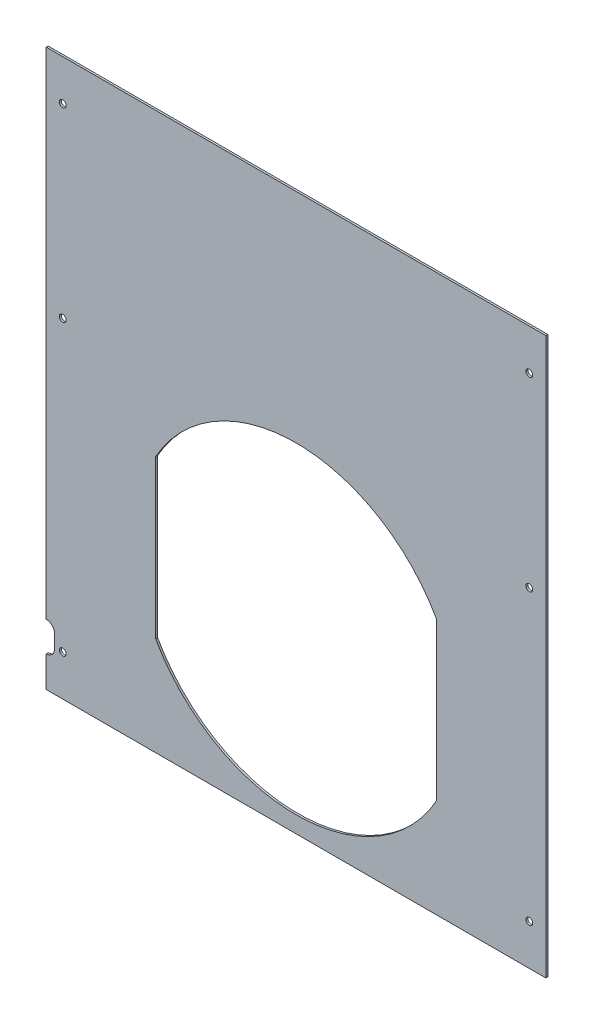
ISO-10303-21;
HEADER;
FILE_DESCRIPTION(('STEP AP214'),'2;1');
FILE_NAME('part.step','',(''),(''),'','','');
FILE_SCHEMA(('AUTOMOTIVE_DESIGN { 1 0 10303 214 1 1 1 1 }'));
ENDSEC;
DATA;
#1=APPLICATION_CONTEXT('core data for automotive mechanical design processes');
#2=APPLICATION_PROTOCOL_DEFINITION('international standard','automotive_design',2000,#1);
#3=PRODUCT_CONTEXT('',#1,'mechanical');
#4=PRODUCT('Part','Part','',(#3));
#5=PRODUCT_RELATED_PRODUCT_CATEGORY('part','',(#4));
#6=PRODUCT_DEFINITION_FORMATION('','',#4);
#7=PRODUCT_DEFINITION_CONTEXT('part definition',#1,'design');
#8=PRODUCT_DEFINITION('design','',#6,#7);
#9=PRODUCT_DEFINITION_SHAPE('','',#8);
#10=(LENGTH_UNIT() NAMED_UNIT(*) SI_UNIT(.MILLI.,.METRE.));
#11=(NAMED_UNIT(*) PLANE_ANGLE_UNIT() SI_UNIT($,.RADIAN.));
#12=(NAMED_UNIT(*) SI_UNIT($,.STERADIAN.) SOLID_ANGLE_UNIT());
#13=UNCERTAINTY_MEASURE_WITH_UNIT(LENGTH_MEASURE(1.E-05),#10,'distance_accuracy_value','');
#14=(GEOMETRIC_REPRESENTATION_CONTEXT(3) GLOBAL_UNCERTAINTY_ASSIGNED_CONTEXT((#13)) GLOBAL_UNIT_ASSIGNED_CONTEXT((#10,
#11,#12)) REPRESENTATION_CONTEXT('',''));
#15=CARTESIAN_POINT('',(0.,0.,0.));
#16=DIRECTION('',(0.,0.,1.));
#17=DIRECTION('',(1.,0.,0.));
#18=AXIS2_PLACEMENT_3D('',#15,#16,#17);
#19=CARTESIAN_POINT('',(-242.,269.5,-1.89738));
#20=DIRECTION('',(-1.,0.,0.));
#21=DIRECTION('',(0.,-1.,0.));
#22=AXIS2_PLACEMENT_3D('',#19,#20,#21);
#23=PLANE('',#22);
#24=DIRECTION('',(0.,0.,1.));
#25=VECTOR('',#24,1.);
#26=CARTESIAN_POINT('',(-242.,-239.5,-1.89738));
#27=LINE('',#26,#25);
#28=CARTESIAN_POINT('',(-242.,-239.5,-1.89738));
#29=VERTEX_POINT('',#28);
#30=CARTESIAN_POINT('',(-242.,-239.5,0.));
#31=VERTEX_POINT('',#30);
#32=EDGE_CURVE('E81',#29,#31,#27,.T.);
#33=ORIENTED_EDGE('',*,*,#32,.F.);
#34=DIRECTION('',(0.,-1.,0.));
#35=VECTOR('',#34,1.);
#36=CARTESIAN_POINT('',(-242.,269.5,-1.89738));
#37=LINE('',#36,#35);
#38=CARTESIAN_POINT('',(-242.,-269.5,-1.89738));
#39=VERTEX_POINT('',#38);
#40=EDGE_CURVE('E151',#29,#39,#37,.T.);
#41=ORIENTED_EDGE('',*,*,#40,.T.);
#42=DIRECTION('',(0.,0.,1.));
#43=VECTOR('',#42,1.);
#44=CARTESIAN_POINT('',(-242.,-269.5,-1.89738));
#45=LINE('',#44,#43);
#46=CARTESIAN_POINT('',(-242.,-269.5,0.));
#47=VERTEX_POINT('',#46);
#48=EDGE_CURVE('E161',#39,#47,#45,.T.);
#49=ORIENTED_EDGE('',*,*,#48,.T.);
#50=DIRECTION('',(0.,-1.,0.));
#51=VECTOR('',#50,1.);
#52=CARTESIAN_POINT('',(-242.,269.5,0.));
#53=LINE('',#52,#51);
#54=EDGE_CURVE('E143',#31,#47,#53,.T.);
#55=ORIENTED_EDGE('',*,*,#54,.F.);
#56=EDGE_LOOP('',(#33,#41,#49,#55));
#57=FACE_BOUND('',#56,.T.);
#58=ADVANCED_FACE('F40',(#57),#23,.T.);
#59=DIRECTION('',(0.,0.,1.));
#60=VECTOR('',#59,1.);
#61=CARTESIAN_POINT('',(-242.,-210.5,-1.89738));
#62=LINE('',#61,#60);
#63=CARTESIAN_POINT('',(-242.,-210.5,-1.89738));
#64=VERTEX_POINT('',#63);
#65=CARTESIAN_POINT('',(-242.,-210.5,0.));
#66=VERTEX_POINT('',#65);
#67=EDGE_CURVE('E139',#64,#66,#62,.T.);
#68=ORIENTED_EDGE('',*,*,#67,.T.);
#69=CARTESIAN_POINT('',(-242.,269.5,0.));
#70=VERTEX_POINT('',#69);
#71=EDGE_CURVE('E137',#70,#66,#53,.T.);
#72=ORIENTED_EDGE('',*,*,#71,.F.);
#73=DIRECTION('',(0.,0.,1.));
#74=VECTOR('',#73,1.);
#75=CARTESIAN_POINT('',(-242.,269.5,-1.89738));
#76=LINE('',#75,#74);
#77=CARTESIAN_POINT('',(-242.,269.5,-1.89738));
#78=VERTEX_POINT('',#77);
#79=EDGE_CURVE('E122',#78,#70,#76,.T.);
#80=ORIENTED_EDGE('',*,*,#79,.F.);
#81=EDGE_CURVE('E153',#78,#64,#37,.T.);
#82=ORIENTED_EDGE('',*,*,#81,.T.);
#83=EDGE_LOOP('',(#68,#72,#80,#82));
#84=FACE_BOUND('',#83,.T.);
#85=ADVANCED_FACE('F42',(#84),#23,.T.);
#86=CARTESIAN_POINT('',(-242.,269.5,-1.89738));
#87=DIRECTION('',(0.,1.,0.));
#88=DIRECTION('',(0.,0.,1.));
#89=AXIS2_PLACEMENT_3D('',#86,#87,#88);
#90=PLANE('',#89);
#91=DIRECTION('',(-1.,0.,0.));
#92=VECTOR('',#91,1.);
#93=CARTESIAN_POINT('',(-242.,269.5,0.));
#94=LINE('',#93,#92);
#95=CARTESIAN_POINT('',(242.,269.5,0.));
#96=VERTEX_POINT('',#95);
#97=EDGE_CURVE('E126',#96,#70,#94,.T.);
#98=ORIENTED_EDGE('',*,*,#97,.F.);
#99=DIRECTION('',(0.,0.,1.));
#100=VECTOR('',#99,1.);
#101=CARTESIAN_POINT('',(242.,269.5,-1.89738));
#102=LINE('',#101,#100);
#103=CARTESIAN_POINT('',(242.,269.5,-1.89738));
#104=VERTEX_POINT('',#103);
#105=EDGE_CURVE('E133',#104,#96,#102,.T.);
#106=ORIENTED_EDGE('',*,*,#105,.F.);
#107=DIRECTION('',(-1.,0.,0.));
#108=VECTOR('',#107,1.);
#109=CARTESIAN_POINT('',(-242.,269.5,-1.89738));
#110=LINE('',#109,#108);
#111=EDGE_CURVE('E128',#104,#78,#110,.T.);
#112=ORIENTED_EDGE('',*,*,#111,.T.);
#113=ORIENTED_EDGE('',*,*,#79,.T.);
#114=EDGE_LOOP('',(#98,#106,#112,#113));
#115=FACE_BOUND('',#114,.T.);
#116=ADVANCED_FACE('F124',(#115),#90,.T.);
#117=CARTESIAN_POINT('',(242.,269.5,-1.89738));
#118=DIRECTION('',(1.,0.,0.));
#119=DIRECTION('',(0.,1.,0.));
#120=AXIS2_PLACEMENT_3D('',#117,#118,#119);
#121=PLANE('',#120);
#122=DIRECTION('',(0.,1.,0.));
#123=VECTOR('',#122,1.);
#124=CARTESIAN_POINT('',(242.,269.5,0.));
#125=LINE('',#124,#123);
#126=CARTESIAN_POINT('',(242.,-269.5,0.));
#127=VERTEX_POINT('',#126);
#128=EDGE_CURVE('E150',#127,#96,#125,.T.);
#129=ORIENTED_EDGE('',*,*,#128,.F.);
#130=DIRECTION('',(0.,0.,1.));
#131=VECTOR('',#130,1.);
#132=CARTESIAN_POINT('',(242.,-269.5,-1.89738));
#133=LINE('',#132,#131);
#134=CARTESIAN_POINT('',(242.,-269.5,-1.89738));
#135=VERTEX_POINT('',#134);
#136=EDGE_CURVE('E159',#135,#127,#133,.T.);
#137=ORIENTED_EDGE('',*,*,#136,.F.);
#138=DIRECTION('',(0.,1.,0.));
#139=VECTOR('',#138,1.);
#140=CARTESIAN_POINT('',(242.,269.5,-1.89738));
#141=LINE('',#140,#139);
#142=EDGE_CURVE('E261',#135,#104,#141,.T.);
#143=ORIENTED_EDGE('',*,*,#142,.T.);
#144=ORIENTED_EDGE('',*,*,#105,.T.);
#145=EDGE_LOOP('',(#129,#137,#143,#144));
#146=FACE_BOUND('',#145,.T.);
#147=ADVANCED_FACE('F271',(#146),#121,.T.);
#148=CARTESIAN_POINT('',(-242.,-269.5,-1.89738));
#149=DIRECTION('',(0.,-1.,0.));
#150=DIRECTION('',(0.,0.,-1.));
#151=AXIS2_PLACEMENT_3D('',#148,#149,#150);
#152=PLANE('',#151);
#153=DIRECTION('',(1.,0.,0.));
#154=VECTOR('',#153,1.);
#155=CARTESIAN_POINT('',(-242.,-269.5,0.));
#156=LINE('',#155,#154);
#157=EDGE_CURVE('E142',#47,#127,#156,.T.);
#158=ORIENTED_EDGE('',*,*,#157,.F.);
#159=ORIENTED_EDGE('',*,*,#48,.F.);
#160=DIRECTION('',(1.,0.,0.));
#161=VECTOR('',#160,1.);
#162=CARTESIAN_POINT('',(-242.,-269.5,-1.89738));
#163=LINE('',#162,#161);
#164=EDGE_CURVE('E258',#39,#135,#163,.T.);
#165=ORIENTED_EDGE('',*,*,#164,.T.);
#166=ORIENTED_EDGE('',*,*,#136,.T.);
#167=EDGE_LOOP('',(#158,#159,#165,#166));
#168=FACE_BOUND('',#167,.T.);
#169=ADVANCED_FACE('F267',(#168),#152,.T.);
#170=CARTESIAN_POINT('',(0.,0.,-1.89738));
#171=DIRECTION('',(0.,0.,1.));
#172=DIRECTION('',(1.,0.,0.));
#173=AXIS2_PLACEMENT_3D('',#170,#171,#172);
#174=PLANE('',#173);
#175=ORIENTED_EDGE('',*,*,#40,.F.);
#176=CARTESIAN_POINT('',(-242.,-231.5,-1.89738));
#177=DIRECTION('',(0.,0.,1.));
#178=DIRECTION('',(-1.,0.,0.));
#179=AXIS2_PLACEMENT_3D('',#176,#177,#178);
#180=CIRCLE('',#179,8.00000000000001);
#181=CARTESIAN_POINT('',(-234.,-231.5,-1.89738));
#182=VERTEX_POINT('',#181);
#183=EDGE_CURVE('E188',#29,#182,#180,.T.);
#184=ORIENTED_EDGE('',*,*,#183,.T.);
#185=DIRECTION('',(0.,1.,0.));
#186=VECTOR('',#185,1.);
#187=CARTESIAN_POINT('',(-234.,-218.5,-1.89738));
#188=LINE('',#187,#186);
#189=CARTESIAN_POINT('',(-234.,-218.5,-1.89738));
#190=VERTEX_POINT('',#189);
#191=EDGE_CURVE('E178',#182,#190,#188,.T.);
#192=ORIENTED_EDGE('',*,*,#191,.T.);
#193=CARTESIAN_POINT('',(-242.,-218.5,-1.89738));
#194=DIRECTION('',(0.,0.,1.));
#195=DIRECTION('',(-1.,0.,0.));
#196=AXIS2_PLACEMENT_3D('',#193,#194,#195);
#197=CIRCLE('',#196,8.00000000000001);
#198=EDGE_CURVE('E182',#190,#64,#197,.T.);
#199=ORIENTED_EDGE('',*,*,#198,.T.);
#200=ORIENTED_EDGE('',*,*,#81,.F.);
#201=ORIENTED_EDGE('',*,*,#111,.F.);
#202=ORIENTED_EDGE('',*,*,#142,.F.);
#203=ORIENTED_EDGE('',*,*,#164,.F.);
#204=EDGE_LOOP('',(#175,#184,#192,#199,#200,#201,#202,#203));
#205=FACE_BOUND('',#204,.T.);
#206=CARTESIAN_POINT('',(226.,230.,-1.89738));
#207=DIRECTION('',(0.,0.,-1.));
#208=DIRECTION('',(0.,1.,0.));
#209=AXIS2_PLACEMENT_3D('',#206,#207,#208);
#210=CIRCLE('',#209,3.29999999999983);
#211=CARTESIAN_POINT('',(226.,233.3,-1.89738));
#212=VERTEX_POINT('',#211);
#213=EDGE_CURVE('E194',#212,#212,#210,.T.);
#214=ORIENTED_EDGE('',*,*,#213,.F.);
#215=EDGE_LOOP('',(#214));
#216=FACE_BOUND('',#215,.T.);
#217=CARTESIAN_POINT('',(-226.,230.,-1.89738));
#218=DIRECTION('',(0.,0.,-1.));
#219=DIRECTION('',(0.,1.,0.));
#220=AXIS2_PLACEMENT_3D('',#217,#218,#219);
#221=CIRCLE('',#220,3.29999999999983);
#222=CARTESIAN_POINT('',(-226.,233.3,-1.89738));
#223=VERTEX_POINT('',#222);
#224=EDGE_CURVE('E201',#223,#223,#221,.T.);
#225=ORIENTED_EDGE('',*,*,#224,.F.);
#226=EDGE_LOOP('',(#225));
#227=FACE_BOUND('',#226,.T.);
#228=CARTESIAN_POINT('',(-226.,-230.,-1.89738));
#229=DIRECTION('',(0.,0.,-1.));
#230=DIRECTION('',(0.,1.,0.));
#231=AXIS2_PLACEMENT_3D('',#228,#229,#230);
#232=CIRCLE('',#231,3.29999999999983);
#233=CARTESIAN_POINT('',(-226.,-226.7,-1.89738));
#234=VERTEX_POINT('',#233);
#235=EDGE_CURVE('E207',#234,#234,#232,.T.);
#236=ORIENTED_EDGE('',*,*,#235,.F.);
#237=EDGE_LOOP('',(#236));
#238=FACE_BOUND('',#237,.T.);
#239=CARTESIAN_POINT('',(226.,-230.,-1.89738));
#240=DIRECTION('',(0.,0.,-1.));
#241=DIRECTION('',(0.,1.,0.));
#242=AXIS2_PLACEMENT_3D('',#239,#240,#241);
#243=CIRCLE('',#242,3.29999999999983);
#244=CARTESIAN_POINT('',(226.,-226.7,-1.89738));
#245=VERTEX_POINT('',#244);
#246=EDGE_CURVE('E213',#245,#245,#243,.T.);
#247=ORIENTED_EDGE('',*,*,#246,.F.);
#248=EDGE_LOOP('',(#247));
#249=FACE_BOUND('',#248,.T.);
#250=CARTESIAN_POINT('',(226.,50.0000000000001,-1.89738));
#251=DIRECTION('',(0.,0.,-1.));
#252=DIRECTION('',(0.,1.,0.));
#253=AXIS2_PLACEMENT_3D('',#250,#251,#252);
#254=CIRCLE('',#253,3.29999999999983);
#255=CARTESIAN_POINT('',(226.,53.3,-1.89738));
#256=VERTEX_POINT('',#255);
#257=EDGE_CURVE('E219',#256,#256,#254,.T.);
#258=ORIENTED_EDGE('',*,*,#257,.F.);
#259=EDGE_LOOP('',(#258));
#260=FACE_BOUND('',#259,.T.);
#261=CARTESIAN_POINT('',(-226.,50.0000000000001,-1.89738));
#262=DIRECTION('',(0.,0.,-1.));
#263=DIRECTION('',(0.,1.,0.));
#264=AXIS2_PLACEMENT_3D('',#261,#262,#263);
#265=CIRCLE('',#264,3.29999999999983);
#266=CARTESIAN_POINT('',(-226.,53.3,-1.89738));
#267=VERTEX_POINT('',#266);
#268=EDGE_CURVE('E225',#267,#267,#265,.T.);
#269=ORIENTED_EDGE('',*,*,#268,.F.);
#270=EDGE_LOOP('',(#269));
#271=FACE_BOUND('',#270,.T.);
#272=DIRECTION('',(0.,1.,0.));
#273=VECTOR('',#272,1.);
#274=CARTESIAN_POINT('',(136.,-21.0801073018289,-1.89738));
#275=LINE('',#274,#273);
#276=CARTESIAN_POINT('',(136.,-173.919892698171,-1.89738));
#277=VERTEX_POINT('',#276);
#278=CARTESIAN_POINT('',(136.,-21.0801073018289,-1.89738));
#279=VERTEX_POINT('',#278);
#280=EDGE_CURVE('E240',#277,#279,#275,.T.);
#281=ORIENTED_EDGE('',*,*,#280,.T.);
#282=CARTESIAN_POINT('',(0.,-97.5,-1.89738));
#283=DIRECTION('',(0.,0.,1.));
#284=DIRECTION('',(1.,0.,0.));
#285=AXIS2_PLACEMENT_3D('',#282,#283,#284);
#286=CIRCLE('',#285,156.);
#287=CARTESIAN_POINT('',(-136.,-21.0801073018289,-1.89738));
#288=VERTEX_POINT('',#287);
#289=EDGE_CURVE('E232',#279,#288,#286,.T.);
#290=ORIENTED_EDGE('',*,*,#289,.T.);
#291=DIRECTION('',(0.,-1.,0.));
#292=VECTOR('',#291,1.);
#293=CARTESIAN_POINT('',(-136.,-21.0801073018289,-1.89738));
#294=LINE('',#293,#292);
#295=CARTESIAN_POINT('',(-136.,-173.919892698171,-1.89738));
#296=VERTEX_POINT('',#295);
#297=EDGE_CURVE('E235',#288,#296,#294,.T.);
#298=ORIENTED_EDGE('',*,*,#297,.T.);
#299=CARTESIAN_POINT('',(0.,-97.5,-1.89738));
#300=DIRECTION('',(0.,0.,1.));
#301=DIRECTION('',(1.,0.,0.));
#302=AXIS2_PLACEMENT_3D('',#299,#300,#301);
#303=CIRCLE('',#302,156.);
#304=EDGE_CURVE('E63',#296,#277,#303,.T.);
#305=ORIENTED_EDGE('',*,*,#304,.T.);
#306=EDGE_LOOP('',(#281,#290,#298,#305));
#307=FACE_BOUND('',#306,.T.);
#308=ADVANCED_FACE('F186',(#205,#216,#227,#238,#249,#260,#271,#307),#174,.F.);
#309=CARTESIAN_POINT('',(0.,0.,0.));
#310=DIRECTION('',(0.,0.,1.));
#311=DIRECTION('',(1.,0.,0.));
#312=AXIS2_PLACEMENT_3D('',#309,#310,#311);
#313=PLANE('',#312);
#314=CARTESIAN_POINT('',(-242.,-231.5,0.));
#315=DIRECTION('',(0.,0.,1.));
#316=DIRECTION('',(1.,0.,0.));
#317=AXIS2_PLACEMENT_3D('',#314,#315,#316);
#318=CIRCLE('',#317,8.00000000000001);
#319=CARTESIAN_POINT('',(-234.,-231.5,0.));
#320=VERTEX_POINT('',#319);
#321=EDGE_CURVE('E11',#31,#320,#318,.T.);
#322=ORIENTED_EDGE('',*,*,#321,.F.);
#323=ORIENTED_EDGE('',*,*,#54,.T.);
#324=ORIENTED_EDGE('',*,*,#157,.T.);
#325=ORIENTED_EDGE('',*,*,#128,.T.);
#326=ORIENTED_EDGE('',*,*,#97,.T.);
#327=ORIENTED_EDGE('',*,*,#71,.T.);
#328=CARTESIAN_POINT('',(-242.,-218.5,0.));
#329=DIRECTION('',(0.,0.,1.));
#330=DIRECTION('',(1.,0.,0.));
#331=AXIS2_PLACEMENT_3D('',#328,#329,#330);
#332=CIRCLE('',#331,8.00000000000001);
#333=CARTESIAN_POINT('',(-234.,-218.5,0.));
#334=VERTEX_POINT('',#333);
#335=EDGE_CURVE('E48',#334,#66,#332,.T.);
#336=ORIENTED_EDGE('',*,*,#335,.F.);
#337=DIRECTION('',(0.,1.,0.));
#338=VECTOR('',#337,1.);
#339=CARTESIAN_POINT('',(-234.,-218.5,0.));
#340=LINE('',#339,#338);
#341=EDGE_CURVE('E132',#320,#334,#340,.T.);
#342=ORIENTED_EDGE('',*,*,#341,.F.);
#343=EDGE_LOOP('',(#322,#323,#324,#325,#326,#327,#336,#342));
#344=FACE_BOUND('',#343,.T.);
#345=CARTESIAN_POINT('',(226.,230.,0.));
#346=DIRECTION('',(0.,0.,-1.));
#347=DIRECTION('',(0.,1.,0.));
#348=AXIS2_PLACEMENT_3D('',#345,#346,#347);
#349=CIRCLE('',#348,3.3);
#350=CARTESIAN_POINT('',(226.,233.3,0.));
#351=VERTEX_POINT('',#350);
#352=EDGE_CURVE('E198',#351,#351,#349,.T.);
#353=ORIENTED_EDGE('',*,*,#352,.T.);
#354=EDGE_LOOP('',(#353));
#355=FACE_BOUND('',#354,.T.);
#356=CARTESIAN_POINT('',(-226.,230.,0.));
#357=DIRECTION('',(0.,0.,-1.));
#358=DIRECTION('',(0.,1.,0.));
#359=AXIS2_PLACEMENT_3D('',#356,#357,#358);
#360=CIRCLE('',#359,3.3);
#361=CARTESIAN_POINT('',(-226.,233.3,0.));
#362=VERTEX_POINT('',#361);
#363=EDGE_CURVE('E204',#362,#362,#360,.T.);
#364=ORIENTED_EDGE('',*,*,#363,.T.);
#365=EDGE_LOOP('',(#364));
#366=FACE_BOUND('',#365,.T.);
#367=CARTESIAN_POINT('',(-226.,-230.,0.));
#368=DIRECTION('',(0.,0.,-1.));
#369=DIRECTION('',(0.,1.,0.));
#370=AXIS2_PLACEMENT_3D('',#367,#368,#369);
#371=CIRCLE('',#370,3.3);
#372=CARTESIAN_POINT('',(-226.,-226.7,0.));
#373=VERTEX_POINT('',#372);
#374=EDGE_CURVE('E210',#373,#373,#371,.T.);
#375=ORIENTED_EDGE('',*,*,#374,.T.);
#376=EDGE_LOOP('',(#375));
#377=FACE_BOUND('',#376,.T.);
#378=CARTESIAN_POINT('',(226.,-230.,0.));
#379=DIRECTION('',(0.,0.,-1.));
#380=DIRECTION('',(0.,1.,0.));
#381=AXIS2_PLACEMENT_3D('',#378,#379,#380);
#382=CIRCLE('',#381,3.3);
#383=CARTESIAN_POINT('',(226.,-226.7,0.));
#384=VERTEX_POINT('',#383);
#385=EDGE_CURVE('E216',#384,#384,#382,.T.);
#386=ORIENTED_EDGE('',*,*,#385,.T.);
#387=EDGE_LOOP('',(#386));
#388=FACE_BOUND('',#387,.T.);
#389=CARTESIAN_POINT('',(226.,50.0000000000001,0.));
#390=DIRECTION('',(0.,0.,-1.));
#391=DIRECTION('',(0.,1.,0.));
#392=AXIS2_PLACEMENT_3D('',#389,#390,#391);
#393=CIRCLE('',#392,3.3);
#394=CARTESIAN_POINT('',(226.,53.3000000000001,0.));
#395=VERTEX_POINT('',#394);
#396=EDGE_CURVE('E222',#395,#395,#393,.T.);
#397=ORIENTED_EDGE('',*,*,#396,.T.);
#398=EDGE_LOOP('',(#397));
#399=FACE_BOUND('',#398,.T.);
#400=CARTESIAN_POINT('',(-226.,50.0000000000001,0.));
#401=DIRECTION('',(0.,0.,-1.));
#402=DIRECTION('',(0.,1.,0.));
#403=AXIS2_PLACEMENT_3D('',#400,#401,#402);
#404=CIRCLE('',#403,3.3);
#405=CARTESIAN_POINT('',(-226.,53.3000000000001,0.));
#406=VERTEX_POINT('',#405);
#407=EDGE_CURVE('E228',#406,#406,#404,.T.);
#408=ORIENTED_EDGE('',*,*,#407,.T.);
#409=EDGE_LOOP('',(#408));
#410=FACE_BOUND('',#409,.T.);
#411=CARTESIAN_POINT('',(0.,-97.5,0.));
#412=DIRECTION('',(0.,0.,1.));
#413=DIRECTION('',(1.,0.,0.));
#414=AXIS2_PLACEMENT_3D('',#411,#412,#413);
#415=CIRCLE('',#414,156.);
#416=CARTESIAN_POINT('',(136.,-21.0801073018289,0.));
#417=VERTEX_POINT('',#416);
#418=CARTESIAN_POINT('',(-136.,-21.0801073018289,0.));
#419=VERTEX_POINT('',#418);
#420=EDGE_CURVE('E231',#417,#419,#415,.T.);
#421=ORIENTED_EDGE('',*,*,#420,.F.);
#422=DIRECTION('',(0.,1.,0.));
#423=VECTOR('',#422,1.);
#424=CARTESIAN_POINT('',(136.,-21.0801073018289,0.));
#425=LINE('',#424,#423);
#426=CARTESIAN_POINT('',(136.,-173.919892698171,0.));
#427=VERTEX_POINT('',#426);
#428=EDGE_CURVE('E236',#427,#417,#425,.T.);
#429=ORIENTED_EDGE('',*,*,#428,.F.);
#430=CARTESIAN_POINT('',(0.,-97.5,0.));
#431=DIRECTION('',(0.,0.,1.));
#432=DIRECTION('',(1.,0.,0.));
#433=AXIS2_PLACEMENT_3D('',#430,#431,#432);
#434=CIRCLE('',#433,156.);
#435=CARTESIAN_POINT('',(-136.,-173.919892698171,0.));
#436=VERTEX_POINT('',#435);
#437=EDGE_CURVE('E247',#436,#427,#434,.T.);
#438=ORIENTED_EDGE('',*,*,#437,.F.);
#439=DIRECTION('',(0.,-1.,0.));
#440=VECTOR('',#439,1.);
#441=CARTESIAN_POINT('',(-136.,-21.0801073018289,0.));
#442=LINE('',#441,#440);
#443=EDGE_CURVE('E245',#419,#436,#442,.T.);
#444=ORIENTED_EDGE('',*,*,#443,.F.);
#445=EDGE_LOOP('',(#421,#429,#438,#444));
#446=FACE_BOUND('',#445,.T.);
#447=ADVANCED_FACE('F146',(#344,#355,#366,#377,#388,#399,#410,#446),#313,.T.);
#448=CARTESIAN_POINT('',(0.,-97.5,-1.89738));
#449=DIRECTION('',(0.,0.,1.));
#450=DIRECTION('',(1.,0.,0.));
#451=AXIS2_PLACEMENT_3D('',#448,#449,#450);
#452=CYLINDRICAL_SURFACE('',#451,156.);
#453=ORIENTED_EDGE('',*,*,#420,.T.);
#454=DIRECTION('',(0.,0.,1.));
#455=VECTOR('',#454,1.);
#456=CARTESIAN_POINT('',(-136.,-21.0801073018289,-1.89738));
#457=LINE('',#456,#455);
#458=EDGE_CURVE('E243',#288,#419,#457,.T.);
#459=ORIENTED_EDGE('',*,*,#458,.F.);
#460=ORIENTED_EDGE('',*,*,#289,.F.);
#461=DIRECTION('',(0.,0.,1.));
#462=VECTOR('',#461,1.);
#463=CARTESIAN_POINT('',(136.,-21.0801073018289,-1.89738));
#464=LINE('',#463,#462);
#465=EDGE_CURVE('E251',#279,#417,#464,.T.);
#466=ORIENTED_EDGE('',*,*,#465,.T.);
#467=EDGE_LOOP('',(#453,#459,#460,#466));
#468=FACE_BOUND('',#467,.T.);
#469=ADVANCED_FACE('F286',(#468),#452,.F.);
#470=CARTESIAN_POINT('',(136.,-21.0801073018289,-1.89738));
#471=DIRECTION('',(1.,0.,0.));
#472=DIRECTION('',(0.,0.,-1.));
#473=AXIS2_PLACEMENT_3D('',#470,#471,#472);
#474=PLANE('',#473);
#475=ORIENTED_EDGE('',*,*,#428,.T.);
#476=ORIENTED_EDGE('',*,*,#465,.F.);
#477=ORIENTED_EDGE('',*,*,#280,.F.);
#478=DIRECTION('',(0.,0.,1.));
#479=VECTOR('',#478,1.);
#480=CARTESIAN_POINT('',(136.,-173.919892698171,-1.89738));
#481=LINE('',#480,#479);
#482=EDGE_CURVE('E253',#277,#427,#481,.T.);
#483=ORIENTED_EDGE('',*,*,#482,.T.);
#484=EDGE_LOOP('',(#475,#476,#477,#483));
#485=FACE_BOUND('',#484,.T.);
#486=ADVANCED_FACE('F282',(#485),#474,.F.);
#487=CARTESIAN_POINT('',(0.,-97.5,-1.89738));
#488=DIRECTION('',(0.,0.,1.));
#489=DIRECTION('',(1.,0.,0.));
#490=AXIS2_PLACEMENT_3D('',#487,#488,#489);
#491=CYLINDRICAL_SURFACE('',#490,156.);
#492=ORIENTED_EDGE('',*,*,#437,.T.);
#493=ORIENTED_EDGE('',*,*,#482,.F.);
#494=ORIENTED_EDGE('',*,*,#304,.F.);
#495=DIRECTION('',(0.,0.,1.));
#496=VECTOR('',#495,1.);
#497=CARTESIAN_POINT('',(-136.,-173.919892698171,-1.89738));
#498=LINE('',#497,#496);
#499=EDGE_CURVE('E86',#296,#436,#498,.T.);
#500=ORIENTED_EDGE('',*,*,#499,.T.);
#501=EDGE_LOOP('',(#492,#493,#494,#500));
#502=FACE_BOUND('',#501,.T.);
#503=ADVANCED_FACE('F294',(#502),#491,.F.);
#504=CARTESIAN_POINT('',(-136.,-21.0801073018289,-1.89738));
#505=DIRECTION('',(-1.,0.,0.));
#506=DIRECTION('',(0.,0.,1.));
#507=AXIS2_PLACEMENT_3D('',#504,#505,#506);
#508=PLANE('',#507);
#509=ORIENTED_EDGE('',*,*,#443,.T.);
#510=ORIENTED_EDGE('',*,*,#499,.F.);
#511=ORIENTED_EDGE('',*,*,#297,.F.);
#512=ORIENTED_EDGE('',*,*,#458,.T.);
#513=EDGE_LOOP('',(#509,#510,#511,#512));
#514=FACE_BOUND('',#513,.T.);
#515=ADVANCED_FACE('F290',(#514),#508,.F.);
#516=CARTESIAN_POINT('',(-226.,50.0000000000001,-1.89738));
#517=DIRECTION('',(0.,0.,-1.));
#518=DIRECTION('',(0.,1.,0.));
#519=AXIS2_PLACEMENT_3D('',#516,#517,#518);
#520=CYLINDRICAL_SURFACE('',#519,3.29999999999991);
#521=ORIENTED_EDGE('',*,*,#407,.F.);
#522=EDGE_LOOP('',(#521));
#523=FACE_BOUND('',#522,.T.);
#524=ORIENTED_EDGE('',*,*,#268,.T.);
#525=EDGE_LOOP('',(#524));
#526=FACE_BOUND('',#525,.T.);
#527=ADVANCED_FACE('F301',(#523,#526),#520,.F.);
#528=CARTESIAN_POINT('',(226.,50.0000000000001,-1.89738));
#529=DIRECTION('',(0.,0.,-1.));
#530=DIRECTION('',(0.,1.,0.));
#531=AXIS2_PLACEMENT_3D('',#528,#529,#530);
#532=CYLINDRICAL_SURFACE('',#531,3.29999999999991);
#533=ORIENTED_EDGE('',*,*,#396,.F.);
#534=EDGE_LOOP('',(#533));
#535=FACE_BOUND('',#534,.T.);
#536=ORIENTED_EDGE('',*,*,#257,.T.);
#537=EDGE_LOOP('',(#536));
#538=FACE_BOUND('',#537,.T.);
#539=ADVANCED_FACE('F358',(#535,#538),#532,.F.);
#540=CARTESIAN_POINT('',(226.,-230.,-1.89738));
#541=DIRECTION('',(0.,0.,-1.));
#542=DIRECTION('',(0.,1.,0.));
#543=AXIS2_PLACEMENT_3D('',#540,#541,#542);
#544=CYLINDRICAL_SURFACE('',#543,3.29999999999991);
#545=ORIENTED_EDGE('',*,*,#385,.F.);
#546=EDGE_LOOP('',(#545));
#547=FACE_BOUND('',#546,.T.);
#548=ORIENTED_EDGE('',*,*,#246,.T.);
#549=EDGE_LOOP('',(#548));
#550=FACE_BOUND('',#549,.T.);
#551=ADVANCED_FACE('F368',(#547,#550),#544,.F.);
#552=CARTESIAN_POINT('',(-226.,-230.,-1.89738));
#553=DIRECTION('',(0.,0.,-1.));
#554=DIRECTION('',(0.,1.,0.));
#555=AXIS2_PLACEMENT_3D('',#552,#553,#554);
#556=CYLINDRICAL_SURFACE('',#555,3.29999999999991);
#557=ORIENTED_EDGE('',*,*,#374,.F.);
#558=EDGE_LOOP('',(#557));
#559=FACE_BOUND('',#558,.T.);
#560=ORIENTED_EDGE('',*,*,#235,.T.);
#561=EDGE_LOOP('',(#560));
#562=FACE_BOUND('',#561,.T.);
#563=ADVANCED_FACE('F378',(#559,#562),#556,.F.);
#564=CARTESIAN_POINT('',(-226.,230.,-1.89738));
#565=DIRECTION('',(0.,0.,-1.));
#566=DIRECTION('',(0.,1.,0.));
#567=AXIS2_PLACEMENT_3D('',#564,#565,#566);
#568=CYLINDRICAL_SURFACE('',#567,3.29999999999991);
#569=ORIENTED_EDGE('',*,*,#363,.F.);
#570=EDGE_LOOP('',(#569));
#571=FACE_BOUND('',#570,.T.);
#572=ORIENTED_EDGE('',*,*,#224,.T.);
#573=EDGE_LOOP('',(#572));
#574=FACE_BOUND('',#573,.T.);
#575=ADVANCED_FACE('F388',(#571,#574),#568,.F.);
#576=CARTESIAN_POINT('',(226.,230.,-1.89738));
#577=DIRECTION('',(0.,0.,-1.));
#578=DIRECTION('',(0.,1.,0.));
#579=AXIS2_PLACEMENT_3D('',#576,#577,#578);
#580=CYLINDRICAL_SURFACE('',#579,3.29999999999991);
#581=ORIENTED_EDGE('',*,*,#352,.F.);
#582=EDGE_LOOP('',(#581));
#583=FACE_BOUND('',#582,.T.);
#584=ORIENTED_EDGE('',*,*,#213,.T.);
#585=EDGE_LOOP('',(#584));
#586=FACE_BOUND('',#585,.T.);
#587=ADVANCED_FACE('F398',(#583,#586),#580,.F.);
#588=CARTESIAN_POINT('',(-242.,-231.5,-1.89738));
#589=DIRECTION('',(0.,0.,1.));
#590=DIRECTION('',(1.,0.,0.));
#591=AXIS2_PLACEMENT_3D('',#588,#589,#590);
#592=CYLINDRICAL_SURFACE('',#591,8.00000000000001);
#593=ORIENTED_EDGE('',*,*,#321,.T.);
#594=DIRECTION('',(0.,0.,1.));
#595=VECTOR('',#594,1.);
#596=CARTESIAN_POINT('',(-234.,-231.5,-1.89738));
#597=LINE('',#596,#595);
#598=EDGE_CURVE('E55',#182,#320,#597,.T.);
#599=ORIENTED_EDGE('',*,*,#598,.F.);
#600=ORIENTED_EDGE('',*,*,#183,.F.);
#601=ORIENTED_EDGE('',*,*,#32,.T.);
#602=EDGE_LOOP('',(#593,#599,#600,#601));
#603=FACE_BOUND('',#602,.T.);
#604=ADVANCED_FACE('F407',(#603),#592,.F.);
#605=CARTESIAN_POINT('',(-242.,-218.5,-1.89738));
#606=DIRECTION('',(0.,0.,1.));
#607=DIRECTION('',(1.,0.,0.));
#608=AXIS2_PLACEMENT_3D('',#605,#606,#607);
#609=CYLINDRICAL_SURFACE('',#608,8.00000000000001);
#610=ORIENTED_EDGE('',*,*,#335,.T.);
#611=ORIENTED_EDGE('',*,*,#67,.F.);
#612=ORIENTED_EDGE('',*,*,#198,.F.);
#613=DIRECTION('',(0.,0.,1.));
#614=VECTOR('',#613,1.);
#615=CARTESIAN_POINT('',(-234.,-218.5,-1.89738));
#616=LINE('',#615,#614);
#617=EDGE_CURVE('E171',#190,#334,#616,.T.);
#618=ORIENTED_EDGE('',*,*,#617,.T.);
#619=EDGE_LOOP('',(#610,#611,#612,#618));
#620=FACE_BOUND('',#619,.T.);
#621=ADVANCED_FACE('F166',(#620),#609,.F.);
#622=CARTESIAN_POINT('',(-234.,-218.5,-1.89738));
#623=DIRECTION('',(1.,0.,0.));
#624=DIRECTION('',(0.,0.,-1.));
#625=AXIS2_PLACEMENT_3D('',#622,#623,#624);
#626=PLANE('',#625);
#627=ORIENTED_EDGE('',*,*,#341,.T.);
#628=ORIENTED_EDGE('',*,*,#617,.F.);
#629=ORIENTED_EDGE('',*,*,#191,.F.);
#630=ORIENTED_EDGE('',*,*,#598,.T.);
#631=EDGE_LOOP('',(#627,#628,#629,#630));
#632=FACE_BOUND('',#631,.T.);
#633=ADVANCED_FACE('F174',(#632),#626,.F.);
#634=CLOSED_SHELL('',(#58,#85,#116,#147,#169,#308,#447,#469,#486,#503,#515,#527,#539,#551,#563,
#575,#587,#604,#621,#633));
#635=MANIFOLD_SOLID_BREP('B2',#634);
#636=ADVANCED_BREP_SHAPE_REPRESENTATION('',(#18,#635),#14);
#637=SHAPE_DEFINITION_REPRESENTATION(#9,#636);
ENDSEC;
END-ISO-10303-21;
